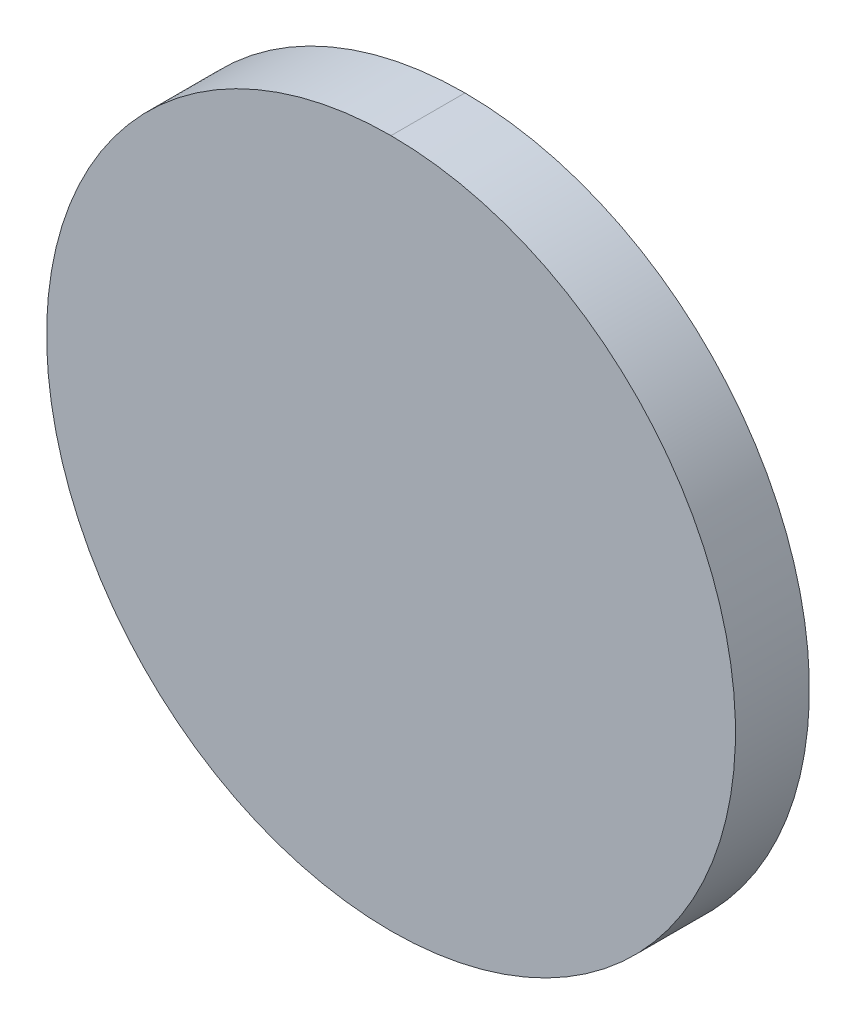
ISO-10303-21;
HEADER;
FILE_DESCRIPTION(('STEP AP214'),'2;1');
FILE_NAME('part.step','',(''),(''),'','','');
FILE_SCHEMA(('AUTOMOTIVE_DESIGN { 1 0 10303 214 1 1 1 1 }'));
ENDSEC;
DATA;
#1=APPLICATION_CONTEXT('core data for automotive mechanical design processes');
#2=APPLICATION_PROTOCOL_DEFINITION('international standard','automotive_design',2000,#1);
#3=PRODUCT_CONTEXT('',#1,'mechanical');
#4=PRODUCT('Part','Part','',(#3));
#5=PRODUCT_RELATED_PRODUCT_CATEGORY('part','',(#4));
#6=PRODUCT_DEFINITION_FORMATION('','',#4);
#7=PRODUCT_DEFINITION_CONTEXT('part definition',#1,'design');
#8=PRODUCT_DEFINITION('design','',#6,#7);
#9=PRODUCT_DEFINITION_SHAPE('','',#8);
#10=(LENGTH_UNIT() NAMED_UNIT(*) SI_UNIT(.MILLI.,.METRE.));
#11=(NAMED_UNIT(*) PLANE_ANGLE_UNIT() SI_UNIT($,.RADIAN.));
#12=(NAMED_UNIT(*) SI_UNIT($,.STERADIAN.) SOLID_ANGLE_UNIT());
#13=UNCERTAINTY_MEASURE_WITH_UNIT(LENGTH_MEASURE(1.E-05),#10,'distance_accuracy_value','');
#14=(GEOMETRIC_REPRESENTATION_CONTEXT(3) GLOBAL_UNCERTAINTY_ASSIGNED_CONTEXT((#13)) GLOBAL_UNIT_ASSIGNED_CONTEXT((#10,
#11,#12)) REPRESENTATION_CONTEXT('',''));
#15=CARTESIAN_POINT('',(0.,0.,0.));
#16=DIRECTION('',(0.,0.,1.));
#17=DIRECTION('',(1.,0.,0.));
#18=AXIS2_PLACEMENT_3D('',#15,#16,#17);
#19=CARTESIAN_POINT('',(0.,0.,0.0762));
#20=DIRECTION('',(0.,0.,1.));
#21=DIRECTION('',(1.,0.,0.));
#22=AXIS2_PLACEMENT_3D('',#19,#20,#21);
#23=PLANE('',#22);
#24=CARTESIAN_POINT('',(0.,0.,0.0762));
#25=DIRECTION('',(0.,0.,1.));
#26=DIRECTION('',(0.,1.,0.));
#27=AXIS2_PLACEMENT_3D('',#24,#25,#26);
#28=CIRCLE('',#27,0.355);
#29=CARTESIAN_POINT('',(0.,0.355,0.0762));
#30=VERTEX_POINT('',#29);
#31=CARTESIAN_POINT('',(0.,-0.355,0.0762));
#32=VERTEX_POINT('',#31);
#33=EDGE_CURVE('E11',#30,#32,#28,.T.);
#34=ORIENTED_EDGE('',*,*,#33,.T.);
#35=CARTESIAN_POINT('',(0.,0.,0.0762));
#36=DIRECTION('',(0.,0.,1.));
#37=DIRECTION('',(0.,-1.,0.));
#38=AXIS2_PLACEMENT_3D('',#35,#36,#37);
#39=CIRCLE('',#38,0.355);
#40=EDGE_CURVE('E59',#32,#30,#39,.T.);
#41=ORIENTED_EDGE('',*,*,#40,.T.);
#42=EDGE_LOOP('',(#34,#41));
#43=FACE_BOUND('',#42,.T.);
#44=ADVANCED_FACE('F17',(#43),#23,.T.);
#45=CARTESIAN_POINT('',(0.,0.,0.));
#46=DIRECTION('',(0.,0.,1.));
#47=DIRECTION('',(0.,-1.,0.));
#48=AXIS2_PLACEMENT_3D('',#45,#46,#47);
#49=CYLINDRICAL_SURFACE('',#48,0.355);
#50=DIRECTION('',(0.,0.,1.));
#51=VECTOR('',#50,1.);
#52=CARTESIAN_POINT('',(0.,-0.355,0.));
#53=LINE('',#52,#51);
#54=CARTESIAN_POINT('',(0.,-0.355,0.));
#55=VERTEX_POINT('',#54);
#56=EDGE_CURVE('E27',#55,#32,#53,.T.);
#57=ORIENTED_EDGE('',*,*,#56,.T.);
#58=ORIENTED_EDGE('',*,*,#33,.F.);
#59=DIRECTION('',(0.,0.,1.));
#60=VECTOR('',#59,1.);
#61=CARTESIAN_POINT('',(0.,0.355,0.));
#62=LINE('',#61,#60);
#63=CARTESIAN_POINT('',(0.,0.355,0.));
#64=VERTEX_POINT('',#63);
#65=EDGE_CURVE('E20',#64,#30,#62,.T.);
#66=ORIENTED_EDGE('',*,*,#65,.F.);
#67=CARTESIAN_POINT('',(0.,0.,0.));
#68=DIRECTION('',(0.,0.,1.));
#69=DIRECTION('',(0.,1.,0.));
#70=AXIS2_PLACEMENT_3D('',#67,#68,#69);
#71=CIRCLE('',#70,0.355);
#72=EDGE_CURVE('E57',#64,#55,#71,.T.);
#73=ORIENTED_EDGE('',*,*,#72,.T.);
#74=EDGE_LOOP('',(#57,#58,#66,#73));
#75=FACE_BOUND('',#74,.T.);
#76=ADVANCED_FACE('F55',(#75),#49,.T.);
#77=CARTESIAN_POINT('',(0.,0.,0.));
#78=DIRECTION('',(0.,0.,1.));
#79=DIRECTION('',(0.,-1.,0.));
#80=AXIS2_PLACEMENT_3D('',#77,#78,#79);
#81=CYLINDRICAL_SURFACE('',#80,0.355);
#82=ORIENTED_EDGE('',*,*,#65,.T.);
#83=ORIENTED_EDGE('',*,*,#40,.F.);
#84=ORIENTED_EDGE('',*,*,#56,.F.);
#85=CARTESIAN_POINT('',(0.,0.,0.));
#86=DIRECTION('',(0.,0.,1.));
#87=DIRECTION('',(0.,-1.,0.));
#88=AXIS2_PLACEMENT_3D('',#85,#86,#87);
#89=CIRCLE('',#88,0.355);
#90=EDGE_CURVE('E60',#55,#64,#89,.T.);
#91=ORIENTED_EDGE('',*,*,#90,.T.);
#92=EDGE_LOOP('',(#82,#83,#84,#91));
#93=FACE_BOUND('',#92,.T.);
#94=ADVANCED_FACE('F61',(#93),#81,.T.);
#95=CARTESIAN_POINT('',(0.,0.,0.));
#96=DIRECTION('',(0.,0.,1.));
#97=DIRECTION('',(1.,0.,0.));
#98=AXIS2_PLACEMENT_3D('',#95,#96,#97);
#99=PLANE('',#98);
#100=ORIENTED_EDGE('',*,*,#72,.F.);
#101=ORIENTED_EDGE('',*,*,#90,.F.);
#102=EDGE_LOOP('',(#100,#101));
#103=FACE_BOUND('',#102,.T.);
#104=ADVANCED_FACE('F64',(#103),#99,.F.);
#105=CLOSED_SHELL('',(#44,#76,#94,#104));
#106=MANIFOLD_SOLID_BREP('B1',#105);
#107=ADVANCED_BREP_SHAPE_REPRESENTATION('',(#18,#106),#14);
#108=SHAPE_DEFINITION_REPRESENTATION(#9,#107);
ENDSEC;
END-ISO-10303-21;
